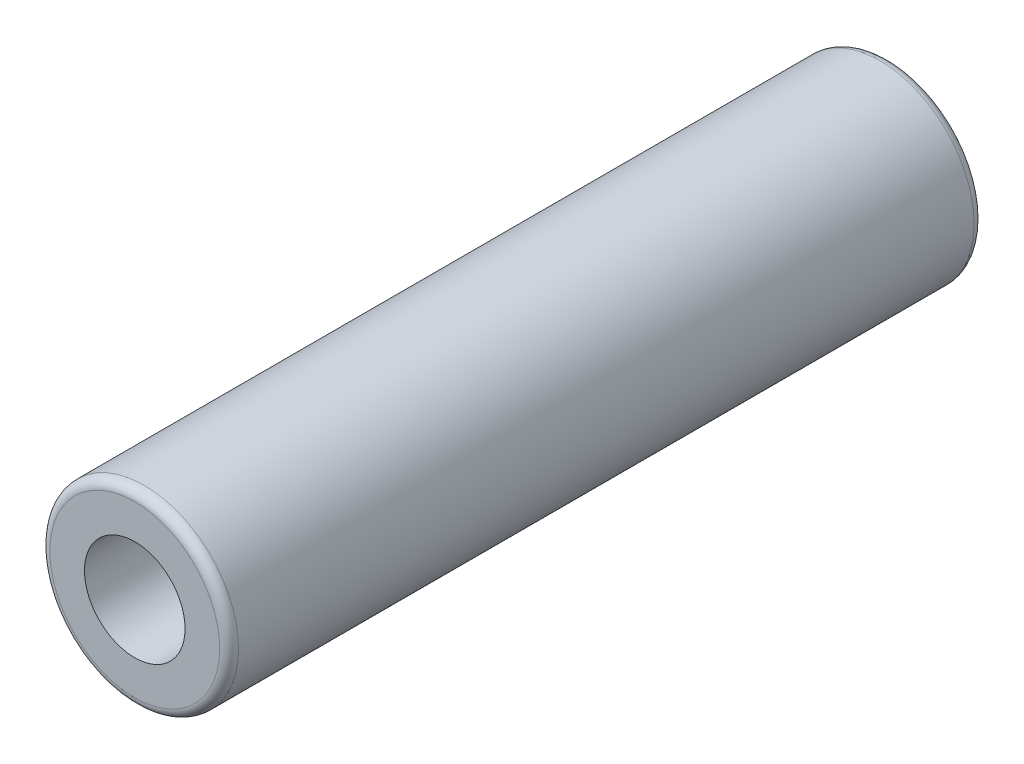
ISO-10303-21;
HEADER;
FILE_DESCRIPTION(('STEP AP214'),'2;1');
FILE_NAME('part.step','',(''),(''),'','','');
FILE_SCHEMA(('AUTOMOTIVE_DESIGN { 1 0 10303 214 1 1 1 1 }'));
ENDSEC;
DATA;
#1=APPLICATION_CONTEXT('core data for automotive mechanical design processes');
#2=APPLICATION_PROTOCOL_DEFINITION('international standard','automotive_design',2000,#1);
#3=PRODUCT_CONTEXT('',#1,'mechanical');
#4=PRODUCT('Part','Part','',(#3));
#5=PRODUCT_RELATED_PRODUCT_CATEGORY('part','',(#4));
#6=PRODUCT_DEFINITION_FORMATION('','',#4);
#7=PRODUCT_DEFINITION_CONTEXT('part definition',#1,'design');
#8=PRODUCT_DEFINITION('design','',#6,#7);
#9=PRODUCT_DEFINITION_SHAPE('','',#8);
#10=(LENGTH_UNIT() NAMED_UNIT(*) SI_UNIT(.MILLI.,.METRE.));
#11=(NAMED_UNIT(*) PLANE_ANGLE_UNIT() SI_UNIT($,.RADIAN.));
#12=(NAMED_UNIT(*) SI_UNIT($,.STERADIAN.) SOLID_ANGLE_UNIT());
#13=UNCERTAINTY_MEASURE_WITH_UNIT(LENGTH_MEASURE(1.E-05),#10,'distance_accuracy_value','');
#14=(GEOMETRIC_REPRESENTATION_CONTEXT(3) GLOBAL_UNCERTAINTY_ASSIGNED_CONTEXT((#13)) GLOBAL_UNIT_ASSIGNED_CONTEXT((#10,
#11,#12)) REPRESENTATION_CONTEXT('',''));
#15=CARTESIAN_POINT('',(0.,0.,0.));
#16=DIRECTION('',(0.,0.,1.));
#17=DIRECTION('',(1.,0.,0.));
#18=AXIS2_PLACEMENT_3D('',#15,#16,#17);
#19=CARTESIAN_POINT('',(0.,0.,24.));
#20=DIRECTION('',(0.,0.,1.));
#21=DIRECTION('',(1.,0.,0.));
#22=AXIS2_PLACEMENT_3D('',#19,#20,#21);
#23=PLANE('',#22);
#24=CARTESIAN_POINT('',(0.,0.,24.));
#25=DIRECTION('',(0.,0.,1.));
#26=DIRECTION('',(1.,0.,0.));
#27=AXIS2_PLACEMENT_3D('',#24,#25,#26);
#28=CIRCLE('',#27,2.7);
#29=CARTESIAN_POINT('',(2.7,0.,24.));
#30=VERTEX_POINT('',#29);
#31=EDGE_CURVE('E10',#30,#30,#28,.T.);
#32=ORIENTED_EDGE('',*,*,#31,.T.);
#33=EDGE_LOOP('',(#32));
#34=FACE_BOUND('',#33,.T.);
#35=CARTESIAN_POINT('',(0.,0.,24.));
#36=DIRECTION('',(0.,0.,1.));
#37=DIRECTION('',(1.,0.,0.));
#38=AXIS2_PLACEMENT_3D('',#35,#36,#37);
#39=CIRCLE('',#38,1.6);
#40=CARTESIAN_POINT('',(1.6,0.,24.));
#41=VERTEX_POINT('',#40);
#42=EDGE_CURVE('E50',#41,#41,#39,.T.);
#43=ORIENTED_EDGE('',*,*,#42,.F.);
#44=EDGE_LOOP('',(#43));
#45=FACE_BOUND('',#44,.T.);
#46=ADVANCED_FACE('F30',(#34,#45),#23,.T.);
#47=CARTESIAN_POINT('',(0.,0.,0.));
#48=DIRECTION('',(0.,0.,1.));
#49=DIRECTION('',(1.,0.,0.));
#50=AXIS2_PLACEMENT_3D('',#47,#48,#49);
#51=PLANE('',#50);
#52=CARTESIAN_POINT('',(0.,0.,0.));
#53=DIRECTION('',(0.,0.,1.));
#54=DIRECTION('',(1.,0.,0.));
#55=AXIS2_PLACEMENT_3D('',#52,#53,#54);
#56=CIRCLE('',#55,2.7);
#57=CARTESIAN_POINT('',(2.7,0.,0.));
#58=VERTEX_POINT('',#57);
#59=EDGE_CURVE('E37',#58,#58,#56,.F.);
#60=ORIENTED_EDGE('',*,*,#59,.T.);
#61=EDGE_LOOP('',(#60));
#62=FACE_BOUND('',#61,.T.);
#63=CARTESIAN_POINT('',(0.,0.,0.));
#64=DIRECTION('',(0.,0.,1.));
#65=DIRECTION('',(1.,0.,0.));
#66=AXIS2_PLACEMENT_3D('',#63,#64,#65);
#67=CIRCLE('',#66,1.6);
#68=CARTESIAN_POINT('',(1.6,0.,0.));
#69=VERTEX_POINT('',#68);
#70=EDGE_CURVE('E51',#69,#69,#67,.T.);
#71=ORIENTED_EDGE('',*,*,#70,.T.);
#72=EDGE_LOOP('',(#71));
#73=FACE_BOUND('',#72,.T.);
#74=ADVANCED_FACE('F61',(#62,#73),#51,.F.);
#75=CARTESIAN_POINT('',(0.,0.,24.));
#76=DIRECTION('',(0.,0.,-1.));
#77=DIRECTION('',(-1.,0.,0.));
#78=AXIS2_PLACEMENT_3D('',#75,#76,#77);
#79=CYLINDRICAL_SURFACE('',#78,3.);
#80=CARTESIAN_POINT('',(0.,0.,0.300000000000002));
#81=DIRECTION('',(0.,0.,1.));
#82=DIRECTION('',(1.,0.,0.));
#83=AXIS2_PLACEMENT_3D('',#80,#81,#82);
#84=CIRCLE('',#83,3.);
#85=CARTESIAN_POINT('',(3.,0.,0.300000000000002));
#86=VERTEX_POINT('',#85);
#87=EDGE_CURVE('E41',#86,#86,#84,.T.);
#88=ORIENTED_EDGE('',*,*,#87,.T.);
#89=EDGE_LOOP('',(#88));
#90=FACE_BOUND('',#89,.T.);
#91=CARTESIAN_POINT('',(0.,0.,23.7));
#92=DIRECTION('',(0.,0.,1.));
#93=DIRECTION('',(1.,0.,0.));
#94=AXIS2_PLACEMENT_3D('',#91,#92,#93);
#95=CIRCLE('',#94,3.);
#96=CARTESIAN_POINT('',(3.,0.,23.7));
#97=VERTEX_POINT('',#96);
#98=EDGE_CURVE('E45',#97,#97,#95,.F.);
#99=ORIENTED_EDGE('',*,*,#98,.T.);
#100=EDGE_LOOP('',(#99));
#101=FACE_BOUND('',#100,.T.);
#102=ADVANCED_FACE('F66',(#90,#101),#79,.T.);
#103=CARTESIAN_POINT('',(0.,0.,24.));
#104=DIRECTION('',(0.,0.,-1.));
#105=DIRECTION('',(-1.,0.,0.));
#106=AXIS2_PLACEMENT_3D('',#103,#104,#105);
#107=CYLINDRICAL_SURFACE('',#106,1.6);
#108=ORIENTED_EDGE('',*,*,#42,.T.);
#109=EDGE_LOOP('',(#108));
#110=FACE_BOUND('',#109,.T.);
#111=ORIENTED_EDGE('',*,*,#70,.F.);
#112=EDGE_LOOP('',(#111));
#113=FACE_BOUND('',#112,.T.);
#114=ADVANCED_FACE('F57',(#110,#113),#107,.F.);
#115=CARTESIAN_POINT('',(0.,0.,0.300000000000002));
#116=DIRECTION('',(0.,0.,1.));
#117=DIRECTION('',(1.,0.,0.));
#118=AXIS2_PLACEMENT_3D('',#115,#116,#117);
#119=TOROIDAL_SURFACE('',#118,2.7,0.3);
#120=ORIENTED_EDGE('',*,*,#59,.F.);
#121=EDGE_LOOP('',(#120));
#122=FACE_BOUND('',#121,.T.);
#123=ORIENTED_EDGE('',*,*,#87,.F.);
#124=EDGE_LOOP('',(#123));
#125=FACE_BOUND('',#124,.T.);
#126=ADVANCED_FACE('F72',(#122,#125),#119,.T.);
#127=CARTESIAN_POINT('',(0.,0.,23.7));
#128=DIRECTION('',(0.,0.,1.));
#129=DIRECTION('',(1.,0.,0.));
#130=AXIS2_PLACEMENT_3D('',#127,#128,#129);
#131=TOROIDAL_SURFACE('',#130,2.7,0.3);
#132=ORIENTED_EDGE('',*,*,#98,.F.);
#133=EDGE_LOOP('',(#132));
#134=FACE_BOUND('',#133,.T.);
#135=ORIENTED_EDGE('',*,*,#31,.F.);
#136=EDGE_LOOP('',(#135));
#137=FACE_BOUND('',#136,.T.);
#138=ADVANCED_FACE('F32',(#134,#137),#131,.T.);
#139=CLOSED_SHELL('',(#46,#74,#102,#114,#126,#138));
#140=MANIFOLD_SOLID_BREP('B2',#139);
#141=ADVANCED_BREP_SHAPE_REPRESENTATION('',(#18,#140),#14);
#142=SHAPE_DEFINITION_REPRESENTATION(#9,#141);
ENDSEC;
END-ISO-10303-21;
